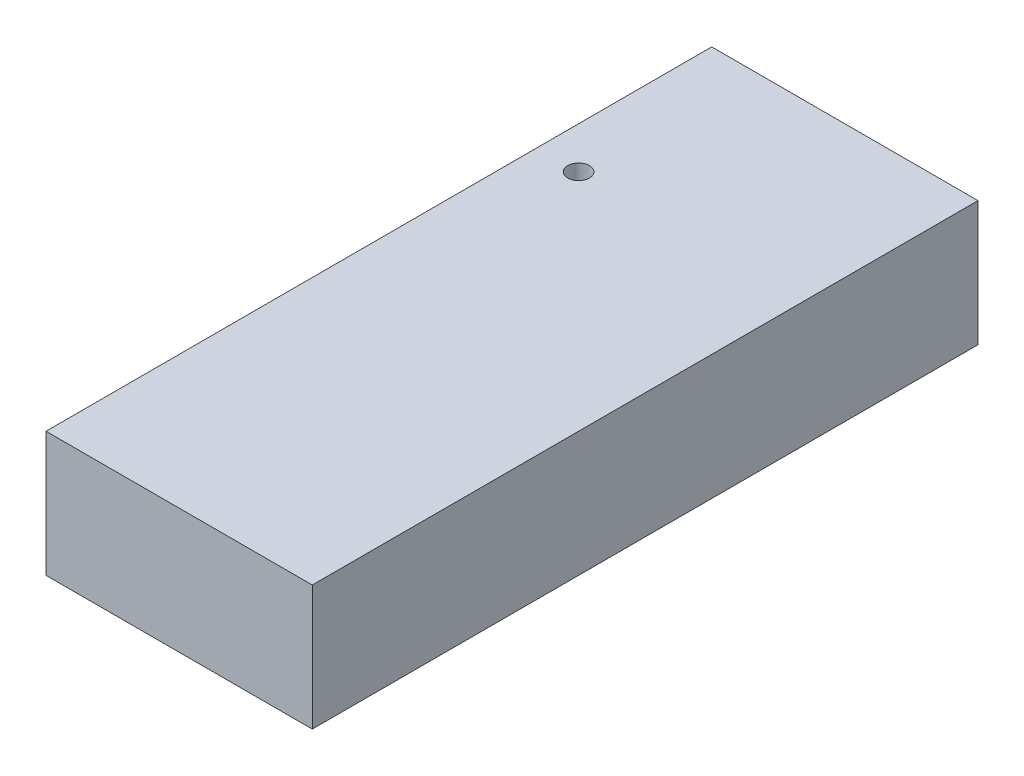
ISO-10303-21;
HEADER;
FILE_DESCRIPTION(('STEP AP214'),'2;1');
FILE_NAME('part.step','',(''),(''),'','','');
FILE_SCHEMA(('AUTOMOTIVE_DESIGN { 1 0 10303 214 1 1 1 1 }'));
ENDSEC;
DATA;
#1=APPLICATION_CONTEXT('core data for automotive mechanical design processes');
#2=APPLICATION_PROTOCOL_DEFINITION('international standard','automotive_design',2000,#1);
#3=PRODUCT_CONTEXT('',#1,'mechanical');
#4=PRODUCT('Part','Part','',(#3));
#5=PRODUCT_RELATED_PRODUCT_CATEGORY('part','',(#4));
#6=PRODUCT_DEFINITION_FORMATION('','',#4);
#7=PRODUCT_DEFINITION_CONTEXT('part definition',#1,'design');
#8=PRODUCT_DEFINITION('design','',#6,#7);
#9=PRODUCT_DEFINITION_SHAPE('','',#8);
#10=(LENGTH_UNIT() NAMED_UNIT(*) SI_UNIT(.MILLI.,.METRE.));
#11=(NAMED_UNIT(*) PLANE_ANGLE_UNIT() SI_UNIT($,.RADIAN.));
#12=(NAMED_UNIT(*) SI_UNIT($,.STERADIAN.) SOLID_ANGLE_UNIT());
#13=UNCERTAINTY_MEASURE_WITH_UNIT(LENGTH_MEASURE(1.E-05),#10,'distance_accuracy_value','');
#14=(GEOMETRIC_REPRESENTATION_CONTEXT(3) GLOBAL_UNCERTAINTY_ASSIGNED_CONTEXT((#13)) GLOBAL_UNIT_ASSIGNED_CONTEXT((#10,
#11,#12)) REPRESENTATION_CONTEXT('',''));
#15=CARTESIAN_POINT('',(0.,0.,0.));
#16=DIRECTION('',(0.,0.,1.));
#17=DIRECTION('',(1.,0.,0.));
#18=AXIS2_PLACEMENT_3D('',#15,#16,#17);
#19=CARTESIAN_POINT('',(0.,9.525,0.));
#20=DIRECTION('',(1.,0.,0.));
#21=DIRECTION('',(0.,0.,-1.));
#22=AXIS2_PLACEMENT_3D('',#19,#20,#21);
#23=PLANE('',#22);
#24=DIRECTION('',(0.,0.,1.));
#25=VECTOR('',#24,1.);
#26=CARTESIAN_POINT('',(0.,0.,0.));
#27=LINE('',#26,#25);
#28=CARTESIAN_POINT('',(0.,0.,-50.8));
#29=VERTEX_POINT('',#28);
#30=CARTESIAN_POINT('',(0.,0.,0.));
#31=VERTEX_POINT('',#30);
#32=EDGE_CURVE('E96',#29,#31,#27,.T.);
#33=ORIENTED_EDGE('',*,*,#32,.T.);
#34=DIRECTION('',(0.,-1.,0.));
#35=VECTOR('',#34,1.);
#36=CARTESIAN_POINT('',(0.,9.525,0.));
#37=LINE('',#36,#35);
#38=CARTESIAN_POINT('',(0.,9.525,0.));
#39=VERTEX_POINT('',#38);
#40=EDGE_CURVE('E11',#39,#31,#37,.T.);
#41=ORIENTED_EDGE('',*,*,#40,.F.);
#42=DIRECTION('',(0.,0.,1.));
#43=VECTOR('',#42,1.);
#44=CARTESIAN_POINT('',(0.,9.525,0.));
#45=LINE('',#44,#43);
#46=CARTESIAN_POINT('',(0.,9.525,-50.8));
#47=VERTEX_POINT('',#46);
#48=EDGE_CURVE('E84',#47,#39,#45,.T.);
#49=ORIENTED_EDGE('',*,*,#48,.F.);
#50=DIRECTION('',(0.,-1.,0.));
#51=VECTOR('',#50,1.);
#52=CARTESIAN_POINT('',(0.,9.525,-50.8));
#53=LINE('',#52,#51);
#54=EDGE_CURVE('E92',#47,#29,#53,.T.);
#55=ORIENTED_EDGE('',*,*,#54,.T.);
#56=EDGE_LOOP('',(#33,#41,#49,#55));
#57=FACE_BOUND('',#56,.T.);
#58=ADVANCED_FACE('F33',(#57),#23,.F.);
#59=CARTESIAN_POINT('',(0.,9.525,0.));
#60=DIRECTION('',(0.,0.,-1.));
#61=DIRECTION('',(-1.,0.,0.));
#62=AXIS2_PLACEMENT_3D('',#59,#60,#61);
#63=PLANE('',#62);
#64=DIRECTION('',(1.,0.,0.));
#65=VECTOR('',#64,1.);
#66=CARTESIAN_POINT('',(0.,0.,0.));
#67=LINE('',#66,#65);
#68=CARTESIAN_POINT('',(20.32,0.,0.));
#69=VERTEX_POINT('',#68);
#70=EDGE_CURVE('E88',#31,#69,#67,.T.);
#71=ORIENTED_EDGE('',*,*,#70,.T.);
#72=DIRECTION('',(0.,-1.,0.));
#73=VECTOR('',#72,1.);
#74=CARTESIAN_POINT('',(20.32,9.525,0.));
#75=LINE('',#74,#73);
#76=CARTESIAN_POINT('',(20.32,9.525,0.));
#77=VERTEX_POINT('',#76);
#78=EDGE_CURVE('E41',#77,#69,#75,.T.);
#79=ORIENTED_EDGE('',*,*,#78,.F.);
#80=DIRECTION('',(1.,0.,0.));
#81=VECTOR('',#80,1.);
#82=CARTESIAN_POINT('',(0.,9.525,0.));
#83=LINE('',#82,#81);
#84=EDGE_CURVE('E79',#39,#77,#83,.T.);
#85=ORIENTED_EDGE('',*,*,#84,.F.);
#86=ORIENTED_EDGE('',*,*,#40,.T.);
#87=EDGE_LOOP('',(#71,#79,#85,#86));
#88=FACE_BOUND('',#87,.T.);
#89=ADVANCED_FACE('F87',(#88),#63,.F.);
#90=CARTESIAN_POINT('',(20.32,9.525,0.));
#91=DIRECTION('',(-1.,0.,0.));
#92=DIRECTION('',(0.,0.,1.));
#93=AXIS2_PLACEMENT_3D('',#90,#91,#92);
#94=PLANE('',#93);
#95=DIRECTION('',(0.,0.,-1.));
#96=VECTOR('',#95,1.);
#97=CARTESIAN_POINT('',(20.32,0.,0.));
#98=LINE('',#97,#96);
#99=CARTESIAN_POINT('',(20.32,0.,-50.8));
#100=VERTEX_POINT('',#99);
#101=EDGE_CURVE('E66',#69,#100,#98,.T.);
#102=ORIENTED_EDGE('',*,*,#101,.T.);
#103=DIRECTION('',(0.,-1.,0.));
#104=VECTOR('',#103,1.);
#105=CARTESIAN_POINT('',(20.32,9.525,-50.8));
#106=LINE('',#105,#104);
#107=CARTESIAN_POINT('',(20.32,9.525,-50.8));
#108=VERTEX_POINT('',#107);
#109=EDGE_CURVE('E89',#108,#100,#106,.T.);
#110=ORIENTED_EDGE('',*,*,#109,.F.);
#111=DIRECTION('',(0.,0.,-1.));
#112=VECTOR('',#111,1.);
#113=CARTESIAN_POINT('',(20.32,9.525,0.));
#114=LINE('',#113,#112);
#115=EDGE_CURVE('E82',#77,#108,#114,.T.);
#116=ORIENTED_EDGE('',*,*,#115,.F.);
#117=ORIENTED_EDGE('',*,*,#78,.T.);
#118=EDGE_LOOP('',(#102,#110,#116,#117));
#119=FACE_BOUND('',#118,.T.);
#120=ADVANCED_FACE('F90',(#119),#94,.F.);
#121=CARTESIAN_POINT('',(0.,9.525,-50.8));
#122=DIRECTION('',(0.,0.,1.));
#123=DIRECTION('',(1.,0.,0.));
#124=AXIS2_PLACEMENT_3D('',#121,#122,#123);
#125=PLANE('',#124);
#126=DIRECTION('',(-1.,0.,0.));
#127=VECTOR('',#126,1.);
#128=CARTESIAN_POINT('',(0.,0.,-50.8));
#129=LINE('',#128,#127);
#130=EDGE_CURVE('E72',#100,#29,#129,.T.);
#131=ORIENTED_EDGE('',*,*,#130,.T.);
#132=ORIENTED_EDGE('',*,*,#54,.F.);
#133=DIRECTION('',(-1.,0.,0.));
#134=VECTOR('',#133,1.);
#135=CARTESIAN_POINT('',(0.,9.525,-50.8));
#136=LINE('',#135,#134);
#137=EDGE_CURVE('E49',#108,#47,#136,.T.);
#138=ORIENTED_EDGE('',*,*,#137,.F.);
#139=ORIENTED_EDGE('',*,*,#109,.T.);
#140=EDGE_LOOP('',(#131,#132,#138,#139));
#141=FACE_BOUND('',#140,.T.);
#142=ADVANCED_FACE('F104',(#141),#125,.F.);
#143=CARTESIAN_POINT('',(0.,9.525,0.));
#144=DIRECTION('',(0.,-1.,0.));
#145=DIRECTION('',(0.,0.,-1.));
#146=AXIS2_PLACEMENT_3D('',#143,#144,#145);
#147=PLANE('',#146);
#148=CARTESIAN_POINT('',(3.175,9.525,-37.465));
#149=DIRECTION('',(0.,1.,0.));
#150=DIRECTION('',(0.,0.,1.));
#151=AXIS2_PLACEMENT_3D('',#148,#149,#150);
#152=CIRCLE('',#151,0.825499999999998);
#153=CARTESIAN_POINT('',(3.175,9.525,-36.6395));
#154=VERTEX_POINT('',#153);
#155=EDGE_CURVE('E110',#154,#154,#152,.T.);
#156=ORIENTED_EDGE('',*,*,#155,.F.);
#157=EDGE_LOOP('',(#156));
#158=FACE_BOUND('',#157,.T.);
#159=ORIENTED_EDGE('',*,*,#48,.T.);
#160=ORIENTED_EDGE('',*,*,#84,.T.);
#161=ORIENTED_EDGE('',*,*,#115,.T.);
#162=ORIENTED_EDGE('',*,*,#137,.T.);
#163=EDGE_LOOP('',(#159,#160,#161,#162));
#164=FACE_BOUND('',#163,.T.);
#165=ADVANCED_FACE('F80',(#158,#164),#147,.F.);
#166=CARTESIAN_POINT('',(0.,0.,0.));
#167=DIRECTION('',(0.,-1.,0.));
#168=DIRECTION('',(0.,0.,-1.));
#169=AXIS2_PLACEMENT_3D('',#166,#167,#168);
#170=PLANE('',#169);
#171=CARTESIAN_POINT('',(3.175,0.,-37.465));
#172=DIRECTION('',(0.,1.,0.));
#173=DIRECTION('',(0.,0.,1.));
#174=AXIS2_PLACEMENT_3D('',#171,#172,#173);
#175=CIRCLE('',#174,0.825499999999998);
#176=CARTESIAN_POINT('',(3.175,0.,-36.6395));
#177=VERTEX_POINT('',#176);
#178=EDGE_CURVE('E99',#177,#177,#175,.T.);
#179=ORIENTED_EDGE('',*,*,#178,.T.);
#180=EDGE_LOOP('',(#179));
#181=FACE_BOUND('',#180,.T.);
#182=ORIENTED_EDGE('',*,*,#32,.F.);
#183=ORIENTED_EDGE('',*,*,#130,.F.);
#184=ORIENTED_EDGE('',*,*,#101,.F.);
#185=ORIENTED_EDGE('',*,*,#70,.F.);
#186=EDGE_LOOP('',(#182,#183,#184,#185));
#187=FACE_BOUND('',#186,.T.);
#188=ADVANCED_FACE('F107',(#181,#187),#170,.T.);
#189=CARTESIAN_POINT('',(3.175,0.,-37.465));
#190=DIRECTION('',(0.,1.,0.));
#191=DIRECTION('',(0.,0.,1.));
#192=AXIS2_PLACEMENT_3D('',#189,#190,#191);
#193=CYLINDRICAL_SURFACE('',#192,0.825499999999998);
#194=CARTESIAN_POINT('',(3.175,0.,-36.6395));
#195=CARTESIAN_POINT('',(3.175,0.0992187499999999,-36.6395));
#196=CARTESIAN_POINT('',(3.175,0.1984375,-36.6395));
#197=CARTESIAN_POINT('',(3.175,0.396875,-36.6395));
#198=CARTESIAN_POINT('',(3.175,0.49609375,-36.6395));
#199=CARTESIAN_POINT('',(3.175,0.69453125,-36.6395));
#200=CARTESIAN_POINT('',(3.175,0.79375,-36.6395));
#201=CARTESIAN_POINT('',(3.175,0.9921875,-36.6395));
#202=CARTESIAN_POINT('',(3.175,1.09140625,-36.6395));
#203=CARTESIAN_POINT('',(3.175,1.28984375,-36.6395));
#204=CARTESIAN_POINT('',(3.175,1.3890625,-36.6395));
#205=CARTESIAN_POINT('',(3.175,1.5875,-36.6395));
#206=CARTESIAN_POINT('',(3.175,1.68671875,-36.6395));
#207=CARTESIAN_POINT('',(3.175,1.88515625,-36.6395));
#208=CARTESIAN_POINT('',(3.175,1.984375,-36.6395));
#209=CARTESIAN_POINT('',(3.175,2.1828125,-36.6395));
#210=CARTESIAN_POINT('',(3.175,2.28203125,-36.6395));
#211=CARTESIAN_POINT('',(3.175,2.48046875,-36.6395));
#212=CARTESIAN_POINT('',(3.175,2.5796875,-36.6395));
#213=CARTESIAN_POINT('',(3.175,2.778125,-36.6395));
#214=CARTESIAN_POINT('',(3.175,2.87734375,-36.6395));
#215=CARTESIAN_POINT('',(3.175,3.07578125,-36.6395));
#216=CARTESIAN_POINT('',(3.175,3.175,-36.6395));
#217=CARTESIAN_POINT('',(3.175,3.3734375,-36.6395));
#218=CARTESIAN_POINT('',(3.175,3.47265625,-36.6395));
#219=CARTESIAN_POINT('',(3.175,3.67109375,-36.6395));
#220=CARTESIAN_POINT('',(3.175,3.7703125,-36.6395));
#221=CARTESIAN_POINT('',(3.175,3.96875,-36.6395));
#222=CARTESIAN_POINT('',(3.175,4.06796875,-36.6395));
#223=CARTESIAN_POINT('',(3.175,4.26640625,-36.6395));
#224=CARTESIAN_POINT('',(3.175,4.365625,-36.6395));
#225=CARTESIAN_POINT('',(3.175,4.5640625,-36.6395));
#226=CARTESIAN_POINT('',(3.175,4.66328125,-36.6395));
#227=CARTESIAN_POINT('',(3.175,4.86171875,-36.6395));
#228=CARTESIAN_POINT('',(3.175,4.9609375,-36.6395));
#229=CARTESIAN_POINT('',(3.175,5.159375,-36.6395));
#230=CARTESIAN_POINT('',(3.175,5.25859375,-36.6395));
#231=CARTESIAN_POINT('',(3.175,5.45703125,-36.6395));
#232=CARTESIAN_POINT('',(3.175,5.55625,-36.6395));
#233=CARTESIAN_POINT('',(3.175,5.7546875,-36.6395));
#234=CARTESIAN_POINT('',(3.175,5.85390625,-36.6395));
#235=CARTESIAN_POINT('',(3.175,6.05234375,-36.6395));
#236=CARTESIAN_POINT('',(3.175,6.1515625,-36.6395));
#237=CARTESIAN_POINT('',(3.175,6.35,-36.6395));
#238=CARTESIAN_POINT('',(3.175,6.44921875,-36.6395));
#239=CARTESIAN_POINT('',(3.175,6.64765625,-36.6395));
#240=CARTESIAN_POINT('',(3.175,6.746875,-36.6395));
#241=CARTESIAN_POINT('',(3.175,6.9453125,-36.6395));
#242=CARTESIAN_POINT('',(3.175,7.04453125,-36.6395));
#243=CARTESIAN_POINT('',(3.175,7.24296875,-36.6395));
#244=CARTESIAN_POINT('',(3.175,7.3421875,-36.6395));
#245=CARTESIAN_POINT('',(3.175,7.540625,-36.6395));
#246=CARTESIAN_POINT('',(3.175,7.63984375,-36.6395));
#247=CARTESIAN_POINT('',(3.175,7.83828125,-36.6395));
#248=CARTESIAN_POINT('',(3.175,7.9375,-36.6395));
#249=CARTESIAN_POINT('',(3.175,8.1359375,-36.6395));
#250=CARTESIAN_POINT('',(3.175,8.23515625,-36.6395));
#251=CARTESIAN_POINT('',(3.175,8.43359375,-36.6395));
#252=CARTESIAN_POINT('',(3.175,8.5328125,-36.6395));
#253=CARTESIAN_POINT('',(3.175,8.73125,-36.6395));
#254=CARTESIAN_POINT('',(3.175,8.83046875,-36.6395));
#255=CARTESIAN_POINT('',(3.175,9.02890625,-36.6395));
#256=CARTESIAN_POINT('',(3.175,9.128125,-36.6395));
#257=CARTESIAN_POINT('',(3.175,9.3265625,-36.6395));
#258=CARTESIAN_POINT('',(3.175,9.42578125,-36.6395));
#259=CARTESIAN_POINT('',(3.175,9.525,-36.6395));
#260=B_SPLINE_CURVE_WITH_KNOTS('',3,(#194,#195,#196,#197,#198,#199,#200,#201,#202,#203,#204,
#205,#206,#207,#208,#209,#210,#211,#212,#213,#214,#215,#216,#217,#218,#219,#220,#221,#222,#223,
#224,#225,#226,#227,#228,#229,#230,#231,#232,#233,#234,#235,#236,#237,#238,#239,#240,#241,#242,
#243,#244,#245,#246,#247,#248,#249,#250,#251,#252,#253,#254,#255,#256,#257,#258,#259),
.UNSPECIFIED.,.F.,.F.,(4,2,2,2,2,2,2,2,2,2,2,2,2,2,2,2,2,2,2,2,2,2,2,2,2,2,2,2,2,2,2,2,4),(0.,
0.29765625,0.5953125,0.89296875,1.190625,1.48828125,1.7859375,2.08359375,2.38125,2.67890625,
2.9765625,3.27421875,3.571875,3.86953125,4.1671875,4.46484375,4.7625,5.06015625,5.3578125,
5.65546875,5.953125,6.25078125,6.5484375,6.84609375,7.14375,7.44140625,7.7390625,8.03671875,
8.334375,8.63203125,8.9296875,9.22734375,9.525),.UNSPECIFIED.);
#261=EDGE_CURVE('BSEAM117',#177,#154,#260,.T.);
#262=ORIENTED_EDGE('',*,*,#178,.F.);
#263=ORIENTED_EDGE('',*,*,#155,.T.);
#264=ORIENTED_EDGE('',*,*,#261,.T.);
#265=ORIENTED_EDGE('',*,*,#261,.F.);
#266=EDGE_LOOP('',(#262,#264,#263,#265));
#267=FACE_BOUND('',#266,.T.);
#268=ADVANCED_FACE('F117',(#267),#193,.F.);
#269=CLOSED_SHELL('',(#58,#89,#120,#142,#165,#188,#268));
#270=MANIFOLD_SOLID_BREP('B2',#269);
#271=ADVANCED_BREP_SHAPE_REPRESENTATION('',(#18,#270),#14);
#272=SHAPE_DEFINITION_REPRESENTATION(#9,#271);
ENDSEC;
END-ISO-10303-21;
